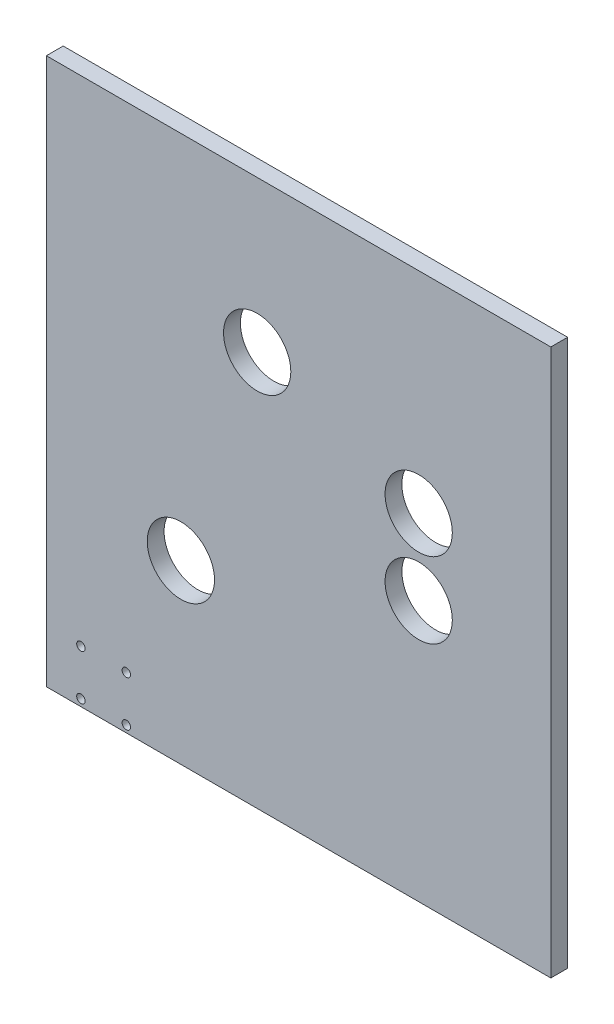
ISO-10303-21;
HEADER;
FILE_DESCRIPTION(('STEP AP214'),'2;1');
FILE_NAME('part.step','',(''),(''),'','','');
FILE_SCHEMA(('AUTOMOTIVE_DESIGN { 1 0 10303 214 1 1 1 1 }'));
ENDSEC;
DATA;
#1=APPLICATION_CONTEXT('core data for automotive mechanical design processes');
#2=APPLICATION_PROTOCOL_DEFINITION('international standard','automotive_design',2000,#1);
#3=PRODUCT_CONTEXT('',#1,'mechanical');
#4=PRODUCT('Part','Part','',(#3));
#5=PRODUCT_RELATED_PRODUCT_CATEGORY('part','',(#4));
#6=PRODUCT_DEFINITION_FORMATION('','',#4);
#7=PRODUCT_DEFINITION_CONTEXT('part definition',#1,'design');
#8=PRODUCT_DEFINITION('design','',#6,#7);
#9=PRODUCT_DEFINITION_SHAPE('','',#8);
#10=(LENGTH_UNIT() NAMED_UNIT(*) SI_UNIT(.MILLI.,.METRE.));
#11=(NAMED_UNIT(*) PLANE_ANGLE_UNIT() SI_UNIT($,.RADIAN.));
#12=(NAMED_UNIT(*) SI_UNIT($,.STERADIAN.) SOLID_ANGLE_UNIT());
#13=UNCERTAINTY_MEASURE_WITH_UNIT(LENGTH_MEASURE(1.E-05),#10,'distance_accuracy_value','');
#14=(GEOMETRIC_REPRESENTATION_CONTEXT(3) GLOBAL_UNCERTAINTY_ASSIGNED_CONTEXT((#13)) GLOBAL_UNIT_ASSIGNED_CONTEXT((#10,
#11,#12)) REPRESENTATION_CONTEXT('',''));
#15=CARTESIAN_POINT('',(0.,0.,0.));
#16=DIRECTION('',(0.,0.,1.));
#17=DIRECTION('',(1.,0.,0.));
#18=AXIS2_PLACEMENT_3D('',#15,#16,#17);
#19=CARTESIAN_POINT('',(150.,-150.,10.));
#20=DIRECTION('',(-1.,0.,0.));
#21=DIRECTION('',(0.,0.,1.));
#22=AXIS2_PLACEMENT_3D('',#19,#20,#21);
#23=PLANE('',#22);
#24=DIRECTION('',(0.,1.,0.));
#25=VECTOR('',#24,1.);
#26=CARTESIAN_POINT('',(150.,-150.,0.));
#27=LINE('',#26,#25);
#28=CARTESIAN_POINT('',(150.,-175.,0.));
#29=VERTEX_POINT('',#28);
#30=CARTESIAN_POINT('',(150.,150.,0.));
#31=VERTEX_POINT('',#30);
#32=EDGE_CURVE('E99',#29,#31,#27,.T.);
#33=ORIENTED_EDGE('',*,*,#32,.T.);
#34=DIRECTION('',(0.,0.,-1.));
#35=VECTOR('',#34,1.);
#36=CARTESIAN_POINT('',(150.,150.,10.));
#37=LINE('',#36,#35);
#38=CARTESIAN_POINT('',(150.,150.,10.));
#39=VERTEX_POINT('',#38);
#40=EDGE_CURVE('E11',#39,#31,#37,.T.);
#41=ORIENTED_EDGE('',*,*,#40,.F.);
#42=DIRECTION('',(0.,1.,0.));
#43=VECTOR('',#42,1.);
#44=CARTESIAN_POINT('',(150.,-150.,10.));
#45=LINE('',#44,#43);
#46=CARTESIAN_POINT('',(150.,-175.,10.));
#47=VERTEX_POINT('',#46);
#48=EDGE_CURVE('E93',#47,#39,#45,.T.);
#49=ORIENTED_EDGE('',*,*,#48,.F.);
#50=DIRECTION('',(0.,0.,1.));
#51=VECTOR('',#50,1.);
#52=CARTESIAN_POINT('',(150.,-175.,0.));
#53=LINE('',#52,#51);
#54=EDGE_CURVE('E103',#29,#47,#53,.T.);
#55=ORIENTED_EDGE('',*,*,#54,.F.);
#56=EDGE_LOOP('',(#33,#41,#49,#55));
#57=FACE_BOUND('',#56,.T.);
#58=ADVANCED_FACE('F45',(#57),#23,.F.);
#59=CARTESIAN_POINT('',(-150.,150.,10.));
#60=DIRECTION('',(0.,-1.,0.));
#61=DIRECTION('',(0.,0.,-1.));
#62=AXIS2_PLACEMENT_3D('',#59,#60,#61);
#63=PLANE('',#62);
#64=DIRECTION('',(-1.,0.,0.));
#65=VECTOR('',#64,1.);
#66=CARTESIAN_POINT('',(-150.,150.,0.));
#67=LINE('',#66,#65);
#68=CARTESIAN_POINT('',(-150.,150.,0.));
#69=VERTEX_POINT('',#68);
#70=EDGE_CURVE('E72',#31,#69,#67,.T.);
#71=ORIENTED_EDGE('',*,*,#70,.T.);
#72=DIRECTION('',(0.,0.,-1.));
#73=VECTOR('',#72,1.);
#74=CARTESIAN_POINT('',(-150.,150.,10.));
#75=LINE('',#74,#73);
#76=CARTESIAN_POINT('',(-150.,150.,10.));
#77=VERTEX_POINT('',#76);
#78=EDGE_CURVE('E53',#77,#69,#75,.T.);
#79=ORIENTED_EDGE('',*,*,#78,.F.);
#80=DIRECTION('',(-1.,0.,0.));
#81=VECTOR('',#80,1.);
#82=CARTESIAN_POINT('',(-150.,150.,10.));
#83=LINE('',#82,#81);
#84=EDGE_CURVE('E61',#39,#77,#83,.T.);
#85=ORIENTED_EDGE('',*,*,#84,.F.);
#86=ORIENTED_EDGE('',*,*,#40,.T.);
#87=EDGE_LOOP('',(#71,#79,#85,#86));
#88=FACE_BOUND('',#87,.T.);
#89=ADVANCED_FACE('F145',(#88),#63,.F.);
#90=CARTESIAN_POINT('',(-150.,-150.,10.));
#91=DIRECTION('',(1.,0.,0.));
#92=DIRECTION('',(0.,0.,-1.));
#93=AXIS2_PLACEMENT_3D('',#90,#91,#92);
#94=PLANE('',#93);
#95=DIRECTION('',(0.,-1.,0.));
#96=VECTOR('',#95,1.);
#97=CARTESIAN_POINT('',(-150.,-150.,0.));
#98=LINE('',#97,#96);
#99=CARTESIAN_POINT('',(-150.,-175.,0.));
#100=VERTEX_POINT('',#99);
#101=EDGE_CURVE('E88',#69,#100,#98,.T.);
#102=ORIENTED_EDGE('',*,*,#101,.T.);
#103=DIRECTION('',(0.,0.,-1.));
#104=VECTOR('',#103,1.);
#105=CARTESIAN_POINT('',(-150.,-175.,10.));
#106=LINE('',#105,#104);
#107=CARTESIAN_POINT('',(-150.,-175.,10.));
#108=VERTEX_POINT('',#107);
#109=EDGE_CURVE('E92',#108,#100,#106,.T.);
#110=ORIENTED_EDGE('',*,*,#109,.F.);
#111=DIRECTION('',(0.,-1.,0.));
#112=VECTOR('',#111,1.);
#113=CARTESIAN_POINT('',(-150.,-150.,10.));
#114=LINE('',#113,#112);
#115=EDGE_CURVE('E76',#77,#108,#114,.T.);
#116=ORIENTED_EDGE('',*,*,#115,.F.);
#117=ORIENTED_EDGE('',*,*,#78,.T.);
#118=EDGE_LOOP('',(#102,#110,#116,#117));
#119=FACE_BOUND('',#118,.T.);
#120=ADVANCED_FACE('F90',(#119),#94,.F.);
#121=CARTESIAN_POINT('',(0.,0.,10.));
#122=DIRECTION('',(0.,0.,-1.));
#123=DIRECTION('',(-1.,0.,0.));
#124=AXIS2_PLACEMENT_3D('',#121,#122,#123);
#125=PLANE('',#124);
#126=CARTESIAN_POINT('',(-102.453643762692,-143.875,10.));
#127=DIRECTION('',(0.,0.,-1.));
#128=DIRECTION('',(-1.,0.,0.));
#129=AXIS2_PLACEMENT_3D('',#126,#127,#128);
#130=CIRCLE('',#129,2.49999999999998);
#131=CARTESIAN_POINT('',(-104.953643762692,-143.875,10.));
#132=VERTEX_POINT('',#131);
#133=EDGE_CURVE('E285',#132,#132,#130,.T.);
#134=ORIENTED_EDGE('',*,*,#133,.T.);
#135=EDGE_LOOP('',(#134));
#136=FACE_BOUND('',#135,.T.);
#137=CARTESIAN_POINT('',(-129.453643762692,-170.875,10.));
#138=DIRECTION('',(0.,0.,-1.));
#139=DIRECTION('',(-1.,0.,0.));
#140=AXIS2_PLACEMENT_3D('',#137,#138,#139);
#141=CIRCLE('',#140,2.5);
#142=CARTESIAN_POINT('',(-131.953643762692,-170.875,10.));
#143=VERTEX_POINT('',#142);
#144=EDGE_CURVE('E299',#143,#143,#141,.T.);
#145=ORIENTED_EDGE('',*,*,#144,.T.);
#146=EDGE_LOOP('',(#145));
#147=FACE_BOUND('',#146,.T.);
#148=CARTESIAN_POINT('',(-102.453643762692,-170.875,10.));
#149=DIRECTION('',(0.,0.,-1.));
#150=DIRECTION('',(-1.,0.,0.));
#151=AXIS2_PLACEMENT_3D('',#148,#149,#150);
#152=CIRCLE('',#151,2.50000000000001);
#153=CARTESIAN_POINT('',(-104.953643762692,-170.875,10.));
#154=VERTEX_POINT('',#153);
#155=EDGE_CURVE('E294',#154,#154,#152,.T.);
#156=ORIENTED_EDGE('',*,*,#155,.T.);
#157=EDGE_LOOP('',(#156));
#158=FACE_BOUND('',#157,.T.);
#159=CARTESIAN_POINT('',(-129.453643762692,-143.875,10.));
#160=DIRECTION('',(0.,0.,-1.));
#161=DIRECTION('',(-1.,0.,0.));
#162=AXIS2_PLACEMENT_3D('',#159,#160,#161);
#163=CIRCLE('',#162,2.50000000000002);
#164=CARTESIAN_POINT('',(-131.953643762692,-143.875,10.));
#165=VERTEX_POINT('',#164);
#166=EDGE_CURVE('E107',#165,#165,#163,.T.);
#167=ORIENTED_EDGE('',*,*,#166,.T.);
#168=EDGE_LOOP('',(#167));
#169=FACE_BOUND('',#168,.T.);
#170=CARTESIAN_POINT('',(-70.,-70.,10.));
#171=DIRECTION('',(0.,0.,1.));
#172=DIRECTION('',(1.,0.,0.));
#173=AXIS2_PLACEMENT_3D('',#170,#171,#172);
#174=CIRCLE('',#173,20.);
#175=CARTESIAN_POINT('',(-50.,-70.,10.));
#176=VERTEX_POINT('',#175);
#177=EDGE_CURVE('E120',#176,#176,#174,.T.);
#178=ORIENTED_EDGE('',*,*,#177,.F.);
#179=EDGE_LOOP('',(#178));
#180=FACE_BOUND('',#179,.T.);
#181=CARTESIAN_POINT('',(71.4213562373095,25.,10.));
#182=DIRECTION('',(0.,0.,1.));
#183=DIRECTION('',(1.,0.,0.));
#184=AXIS2_PLACEMENT_3D('',#181,#182,#183);
#185=CIRCLE('',#184,20.);
#186=CARTESIAN_POINT('',(91.4213562373095,25.,10.));
#187=VERTEX_POINT('',#186);
#188=EDGE_CURVE('E124',#187,#187,#185,.T.);
#189=ORIENTED_EDGE('',*,*,#188,.F.);
#190=EDGE_LOOP('',(#189));
#191=FACE_BOUND('',#190,.T.);
#192=CARTESIAN_POINT('',(-24.6255073241833,60.,10.));
#193=DIRECTION('',(0.,0.,1.));
#194=DIRECTION('',(1.,0.,0.));
#195=AXIS2_PLACEMENT_3D('',#192,#193,#194);
#196=CIRCLE('',#195,20.);
#197=CARTESIAN_POINT('',(-4.62550732418325,60.,10.));
#198=VERTEX_POINT('',#197);
#199=EDGE_CURVE('E135',#198,#198,#196,.T.);
#200=ORIENTED_EDGE('',*,*,#199,.F.);
#201=EDGE_LOOP('',(#200));
#202=FACE_BOUND('',#201,.T.);
#203=CARTESIAN_POINT('',(71.4213562373095,-20.,10.));
#204=DIRECTION('',(0.,0.,1.));
#205=DIRECTION('',(1.,0.,0.));
#206=AXIS2_PLACEMENT_3D('',#203,#204,#205);
#207=CIRCLE('',#206,20.);
#208=CARTESIAN_POINT('',(91.4213562373095,-20.,10.));
#209=VERTEX_POINT('',#208);
#210=EDGE_CURVE('E123',#209,#209,#207,.T.);
#211=ORIENTED_EDGE('',*,*,#210,.F.);
#212=EDGE_LOOP('',(#211));
#213=FACE_BOUND('',#212,.T.);
#214=ORIENTED_EDGE('',*,*,#48,.T.);
#215=ORIENTED_EDGE('',*,*,#84,.T.);
#216=ORIENTED_EDGE('',*,*,#115,.T.);
#217=DIRECTION('',(-1.,0.,0.));
#218=VECTOR('',#217,1.);
#219=CARTESIAN_POINT('',(150.,-175.,10.));
#220=LINE('',#219,#218);
#221=EDGE_CURVE('E106',#47,#108,#220,.T.);
#222=ORIENTED_EDGE('',*,*,#221,.F.);
#223=EDGE_LOOP('',(#214,#215,#216,#222));
#224=FACE_BOUND('',#223,.T.);
#225=ADVANCED_FACE('F148',(#136,#147,#158,#169,#180,#191,#202,#213,#224),#125,.F.);
#226=CARTESIAN_POINT('',(0.,0.,0.));
#227=DIRECTION('',(0.,0.,-1.));
#228=DIRECTION('',(-1.,0.,0.));
#229=AXIS2_PLACEMENT_3D('',#226,#227,#228);
#230=PLANE('',#229);
#231=CARTESIAN_POINT('',(-102.453643762692,-143.875,0.));
#232=DIRECTION('',(0.,0.,-1.));
#233=DIRECTION('',(-1.,0.,0.));
#234=AXIS2_PLACEMENT_3D('',#231,#232,#233);
#235=CIRCLE('',#234,2.49999999999998);
#236=CARTESIAN_POINT('',(-104.953643762692,-143.875,0.));
#237=VERTEX_POINT('',#236);
#238=EDGE_CURVE('E288',#237,#237,#235,.T.);
#239=ORIENTED_EDGE('',*,*,#238,.F.);
#240=EDGE_LOOP('',(#239));
#241=FACE_BOUND('',#240,.T.);
#242=CARTESIAN_POINT('',(-129.453643762692,-170.875,0.));
#243=DIRECTION('',(0.,0.,-1.));
#244=DIRECTION('',(-1.,0.,0.));
#245=AXIS2_PLACEMENT_3D('',#242,#243,#244);
#246=CIRCLE('',#245,2.5);
#247=CARTESIAN_POINT('',(-131.953643762692,-170.875,0.));
#248=VERTEX_POINT('',#247);
#249=EDGE_CURVE('E291',#248,#248,#246,.T.);
#250=ORIENTED_EDGE('',*,*,#249,.F.);
#251=EDGE_LOOP('',(#250));
#252=FACE_BOUND('',#251,.T.);
#253=CARTESIAN_POINT('',(-102.453643762692,-170.875,0.));
#254=DIRECTION('',(0.,0.,-1.));
#255=DIRECTION('',(-1.,0.,0.));
#256=AXIS2_PLACEMENT_3D('',#253,#254,#255);
#257=CIRCLE('',#256,2.50000000000001);
#258=CARTESIAN_POINT('',(-104.953643762692,-170.875,0.));
#259=VERTEX_POINT('',#258);
#260=EDGE_CURVE('E301',#259,#259,#257,.T.);
#261=ORIENTED_EDGE('',*,*,#260,.F.);
#262=EDGE_LOOP('',(#261));
#263=FACE_BOUND('',#262,.T.);
#264=CARTESIAN_POINT('',(-129.453643762692,-143.875,0.));
#265=DIRECTION('',(0.,0.,-1.));
#266=DIRECTION('',(-1.,0.,0.));
#267=AXIS2_PLACEMENT_3D('',#264,#265,#266);
#268=CIRCLE('',#267,2.50000000000002);
#269=CARTESIAN_POINT('',(-131.953643762692,-143.875,0.));
#270=VERTEX_POINT('',#269);
#271=EDGE_CURVE('E110',#270,#270,#268,.T.);
#272=ORIENTED_EDGE('',*,*,#271,.F.);
#273=EDGE_LOOP('',(#272));
#274=FACE_BOUND('',#273,.T.);
#275=CARTESIAN_POINT('',(-70.,-70.,0.));
#276=DIRECTION('',(0.,0.,1.));
#277=DIRECTION('',(1.,0.,0.));
#278=AXIS2_PLACEMENT_3D('',#275,#276,#277);
#279=CIRCLE('',#278,20.);
#280=CARTESIAN_POINT('',(-50.,-70.,0.));
#281=VERTEX_POINT('',#280);
#282=EDGE_CURVE('E117',#281,#281,#279,.T.);
#283=ORIENTED_EDGE('',*,*,#282,.T.);
#284=EDGE_LOOP('',(#283));
#285=FACE_BOUND('',#284,.T.);
#286=CARTESIAN_POINT('',(71.4213562373095,25.,0.));
#287=DIRECTION('',(0.,0.,1.));
#288=DIRECTION('',(1.,0.,0.));
#289=AXIS2_PLACEMENT_3D('',#286,#287,#288);
#290=CIRCLE('',#289,20.);
#291=CARTESIAN_POINT('',(91.4213562373095,25.,0.));
#292=VERTEX_POINT('',#291);
#293=EDGE_CURVE('E116',#292,#292,#290,.T.);
#294=ORIENTED_EDGE('',*,*,#293,.T.);
#295=EDGE_LOOP('',(#294));
#296=FACE_BOUND('',#295,.T.);
#297=CARTESIAN_POINT('',(-24.6255073241833,60.,0.));
#298=DIRECTION('',(0.,0.,1.));
#299=DIRECTION('',(1.,0.,0.));
#300=AXIS2_PLACEMENT_3D('',#297,#298,#299);
#301=CIRCLE('',#300,20.);
#302=CARTESIAN_POINT('',(-4.62550732418325,60.,0.));
#303=VERTEX_POINT('',#302);
#304=EDGE_CURVE('E127',#303,#303,#301,.T.);
#305=ORIENTED_EDGE('',*,*,#304,.T.);
#306=EDGE_LOOP('',(#305));
#307=FACE_BOUND('',#306,.T.);
#308=CARTESIAN_POINT('',(71.4213562373095,-20.,0.));
#309=DIRECTION('',(0.,0.,1.));
#310=DIRECTION('',(1.,0.,0.));
#311=AXIS2_PLACEMENT_3D('',#308,#309,#310);
#312=CIRCLE('',#311,20.);
#313=CARTESIAN_POINT('',(91.4213562373095,-20.,0.));
#314=VERTEX_POINT('',#313);
#315=EDGE_CURVE('E132',#314,#314,#312,.T.);
#316=ORIENTED_EDGE('',*,*,#315,.T.);
#317=EDGE_LOOP('',(#316));
#318=FACE_BOUND('',#317,.T.);
#319=ORIENTED_EDGE('',*,*,#32,.F.);
#320=DIRECTION('',(1.,0.,0.));
#321=VECTOR('',#320,1.);
#322=CARTESIAN_POINT('',(-150.,-175.,0.));
#323=LINE('',#322,#321);
#324=EDGE_CURVE('E96',#100,#29,#323,.T.);
#325=ORIENTED_EDGE('',*,*,#324,.F.);
#326=ORIENTED_EDGE('',*,*,#101,.F.);
#327=ORIENTED_EDGE('',*,*,#70,.F.);
#328=EDGE_LOOP('',(#319,#325,#326,#327));
#329=FACE_BOUND('',#328,.T.);
#330=ADVANCED_FACE('F97',(#241,#252,#263,#274,#285,#296,#307,#318,#329),#230,.T.);
#331=CARTESIAN_POINT('',(71.4213562373095,-20.,0.));
#332=DIRECTION('',(0.,0.,1.));
#333=DIRECTION('',(1.,0.,0.));
#334=AXIS2_PLACEMENT_3D('',#331,#332,#333);
#335=CYLINDRICAL_SURFACE('',#334,20.);
#336=ORIENTED_EDGE('',*,*,#315,.F.);
#337=EDGE_LOOP('',(#336));
#338=FACE_BOUND('',#337,.T.);
#339=ORIENTED_EDGE('',*,*,#210,.T.);
#340=EDGE_LOOP('',(#339));
#341=FACE_BOUND('',#340,.T.);
#342=ADVANCED_FACE('F156',(#338,#341),#335,.F.);
#343=CARTESIAN_POINT('',(-24.6255073241833,60.,0.));
#344=DIRECTION('',(0.,0.,1.));
#345=DIRECTION('',(1.,0.,0.));
#346=AXIS2_PLACEMENT_3D('',#343,#344,#345);
#347=CYLINDRICAL_SURFACE('',#346,20.);
#348=ORIENTED_EDGE('',*,*,#304,.F.);
#349=EDGE_LOOP('',(#348));
#350=FACE_BOUND('',#349,.T.);
#351=ORIENTED_EDGE('',*,*,#199,.T.);
#352=EDGE_LOOP('',(#351));
#353=FACE_BOUND('',#352,.T.);
#354=ADVANCED_FACE('F180',(#350,#353),#347,.F.);
#355=CARTESIAN_POINT('',(71.4213562373095,25.,0.));
#356=DIRECTION('',(0.,0.,1.));
#357=DIRECTION('',(1.,0.,0.));
#358=AXIS2_PLACEMENT_3D('',#355,#356,#357);
#359=CYLINDRICAL_SURFACE('',#358,20.);
#360=ORIENTED_EDGE('',*,*,#293,.F.);
#361=EDGE_LOOP('',(#360));
#362=FACE_BOUND('',#361,.T.);
#363=ORIENTED_EDGE('',*,*,#188,.T.);
#364=EDGE_LOOP('',(#363));
#365=FACE_BOUND('',#364,.T.);
#366=ADVANCED_FACE('F190',(#362,#365),#359,.F.);
#367=CARTESIAN_POINT('',(-70.,-70.,0.));
#368=DIRECTION('',(0.,0.,1.));
#369=DIRECTION('',(1.,0.,0.));
#370=AXIS2_PLACEMENT_3D('',#367,#368,#369);
#371=CYLINDRICAL_SURFACE('',#370,20.);
#372=ORIENTED_EDGE('',*,*,#282,.F.);
#373=EDGE_LOOP('',(#372));
#374=FACE_BOUND('',#373,.T.);
#375=ORIENTED_EDGE('',*,*,#177,.T.);
#376=EDGE_LOOP('',(#375));
#377=FACE_BOUND('',#376,.T.);
#378=ADVANCED_FACE('F197',(#374,#377),#371,.F.);
#379=CARTESIAN_POINT('',(0.,-175.,0.));
#380=DIRECTION('',(0.,-1.,0.));
#381=DIRECTION('',(0.,0.,-1.));
#382=AXIS2_PLACEMENT_3D('',#379,#380,#381);
#383=PLANE('',#382);
#384=ORIENTED_EDGE('',*,*,#109,.T.);
#385=ORIENTED_EDGE('',*,*,#324,.T.);
#386=ORIENTED_EDGE('',*,*,#54,.T.);
#387=ORIENTED_EDGE('',*,*,#221,.T.);
#388=EDGE_LOOP('',(#384,#385,#386,#387));
#389=FACE_BOUND('',#388,.T.);
#390=ADVANCED_FACE('F105',(#389),#383,.T.);
#391=CARTESIAN_POINT('',(-129.453643762692,-143.875,10.));
#392=DIRECTION('',(0.,0.,-1.));
#393=DIRECTION('',(-1.,0.,0.));
#394=AXIS2_PLACEMENT_3D('',#391,#392,#393);
#395=CYLINDRICAL_SURFACE('',#394,2.50000000000002);
#396=ORIENTED_EDGE('',*,*,#166,.F.);
#397=EDGE_LOOP('',(#396));
#398=FACE_BOUND('',#397,.T.);
#399=ORIENTED_EDGE('',*,*,#271,.T.);
#400=EDGE_LOOP('',(#399));
#401=FACE_BOUND('',#400,.T.);
#402=ADVANCED_FACE('F242',(#398,#401),#395,.F.);
#403=CARTESIAN_POINT('',(-102.453643762692,-170.875,10.));
#404=DIRECTION('',(0.,0.,-1.));
#405=DIRECTION('',(-1.,0.,0.));
#406=AXIS2_PLACEMENT_3D('',#403,#404,#405);
#407=CYLINDRICAL_SURFACE('',#406,2.50000000000001);
#408=ORIENTED_EDGE('',*,*,#155,.F.);
#409=EDGE_LOOP('',(#408));
#410=FACE_BOUND('',#409,.T.);
#411=ORIENTED_EDGE('',*,*,#260,.T.);
#412=EDGE_LOOP('',(#411));
#413=FACE_BOUND('',#412,.T.);
#414=ADVANCED_FACE('F250',(#410,#413),#407,.F.);
#415=CARTESIAN_POINT('',(-129.453643762692,-170.875,10.));
#416=DIRECTION('',(0.,0.,-1.));
#417=DIRECTION('',(-1.,0.,0.));
#418=AXIS2_PLACEMENT_3D('',#415,#416,#417);
#419=CYLINDRICAL_SURFACE('',#418,2.5);
#420=ORIENTED_EDGE('',*,*,#144,.F.);
#421=EDGE_LOOP('',(#420));
#422=FACE_BOUND('',#421,.T.);
#423=ORIENTED_EDGE('',*,*,#249,.T.);
#424=EDGE_LOOP('',(#423));
#425=FACE_BOUND('',#424,.T.);
#426=ADVANCED_FACE('F260',(#422,#425),#419,.F.);
#427=CARTESIAN_POINT('',(-102.453643762692,-143.875,10.));
#428=DIRECTION('',(0.,0.,-1.));
#429=DIRECTION('',(-1.,0.,0.));
#430=AXIS2_PLACEMENT_3D('',#427,#428,#429);
#431=CYLINDRICAL_SURFACE('',#430,2.49999999999998);
#432=ORIENTED_EDGE('',*,*,#133,.F.);
#433=EDGE_LOOP('',(#432));
#434=FACE_BOUND('',#433,.T.);
#435=ORIENTED_EDGE('',*,*,#238,.T.);
#436=EDGE_LOOP('',(#435));
#437=FACE_BOUND('',#436,.T.);
#438=ADVANCED_FACE('F270',(#434,#437),#431,.F.);
#439=CLOSED_SHELL('',(#58,#89,#120,#225,#330,#342,#354,#366,#378,#390,#402,#414,#426,#438));
#440=MANIFOLD_SOLID_BREP('B2',#439);
#441=ADVANCED_BREP_SHAPE_REPRESENTATION('',(#18,#440),#14);
#442=SHAPE_DEFINITION_REPRESENTATION(#9,#441);
ENDSEC;
END-ISO-10303-21;
